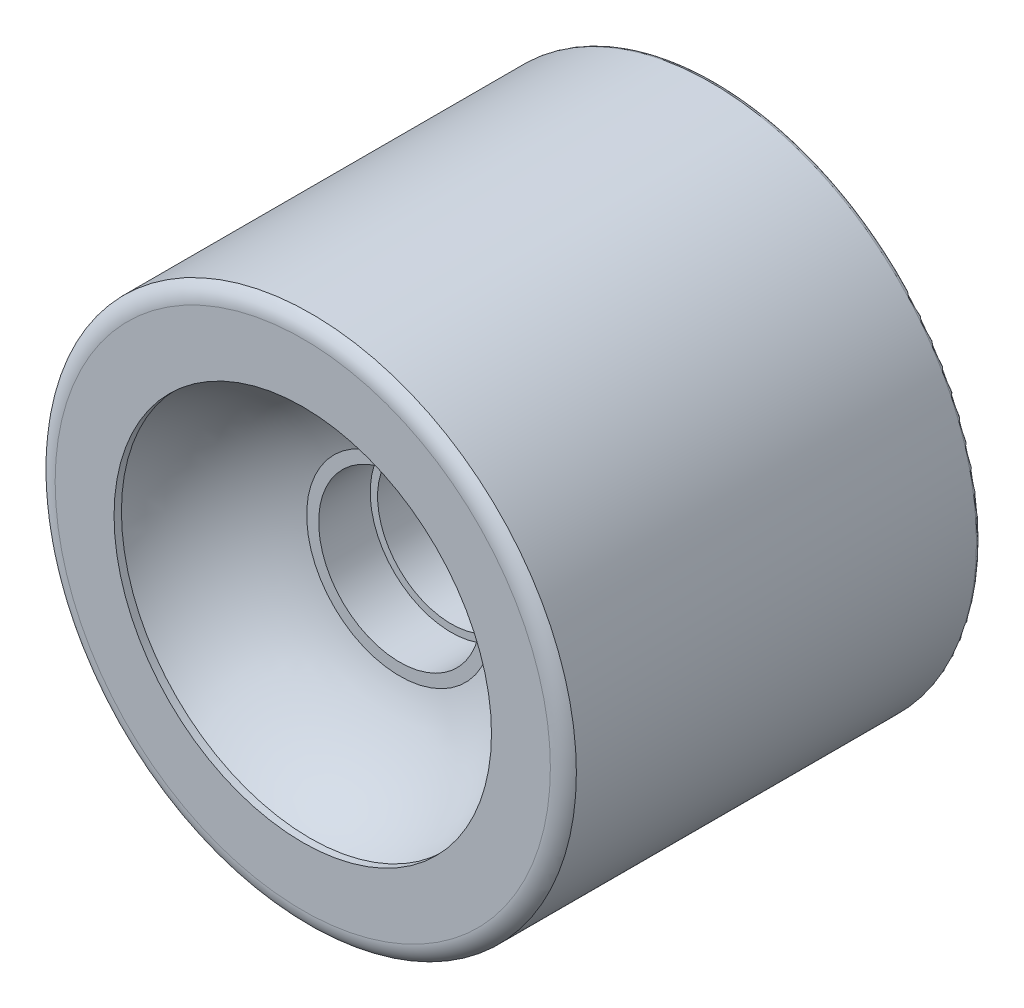
ISO-10303-21;
HEADER;
FILE_DESCRIPTION(('STEP AP214'),'2;1');
FILE_NAME('part.step','',(''),(''),'','','');
FILE_SCHEMA(('AUTOMOTIVE_DESIGN { 1 0 10303 214 1 1 1 1 }'));
ENDSEC;
DATA;
#1=APPLICATION_CONTEXT('core data for automotive mechanical design processes');
#2=APPLICATION_PROTOCOL_DEFINITION('international standard','automotive_design',2000,#1);
#3=PRODUCT_CONTEXT('',#1,'mechanical');
#4=PRODUCT('Part','Part','',(#3));
#5=PRODUCT_RELATED_PRODUCT_CATEGORY('part','',(#4));
#6=PRODUCT_DEFINITION_FORMATION('','',#4);
#7=PRODUCT_DEFINITION_CONTEXT('part definition',#1,'design');
#8=PRODUCT_DEFINITION('design','',#6,#7);
#9=PRODUCT_DEFINITION_SHAPE('','',#8);
#10=(LENGTH_UNIT() NAMED_UNIT(*) SI_UNIT(.MILLI.,.METRE.));
#11=(NAMED_UNIT(*) PLANE_ANGLE_UNIT() SI_UNIT($,.RADIAN.));
#12=(NAMED_UNIT(*) SI_UNIT($,.STERADIAN.) SOLID_ANGLE_UNIT());
#13=UNCERTAINTY_MEASURE_WITH_UNIT(LENGTH_MEASURE(1.E-05),#10,'distance_accuracy_value','');
#14=(GEOMETRIC_REPRESENTATION_CONTEXT(3) GLOBAL_UNCERTAINTY_ASSIGNED_CONTEXT((#13)) GLOBAL_UNIT_ASSIGNED_CONTEXT((#10,
#11,#12)) REPRESENTATION_CONTEXT('',''));
#15=CARTESIAN_POINT('',(0.,0.,0.));
#16=DIRECTION('',(0.,0.,1.));
#17=DIRECTION('',(1.,0.,0.));
#18=AXIS2_PLACEMENT_3D('',#15,#16,#17);
#19=CARTESIAN_POINT('',(30.,0.,-56.));
#20=DIRECTION('',(0.,0.,-1.));
#21=DIRECTION('',(-1.,0.,0.));
#22=AXIS2_PLACEMENT_3D('',#19,#20,#21);
#23=PLANE('',#22);
#24=CARTESIAN_POINT('',(0.,0.,-56.));
#25=DIRECTION('',(0.,0.,-1.));
#26=DIRECTION('',(-1.,0.,0.));
#27=AXIS2_PLACEMENT_3D('',#24,#25,#26);
#28=CIRCLE('',#27,35.5);
#29=CARTESIAN_POINT('',(-35.5,0.,-56.));
#30=VERTEX_POINT('',#29);
#31=EDGE_CURVE('E10',#30,#30,#28,.T.);
#32=ORIENTED_EDGE('',*,*,#31,.T.);
#33=EDGE_LOOP('',(#32));
#34=FACE_BOUND('',#33,.T.);
#35=CARTESIAN_POINT('',(0.,0.,-56.));
#36=DIRECTION('',(0.,0.,1.));
#37=DIRECTION('',(1.,0.,0.));
#38=AXIS2_PLACEMENT_3D('',#35,#36,#37);
#39=CIRCLE('',#38,30.);
#40=CARTESIAN_POINT('',(30.,0.,-56.));
#41=VERTEX_POINT('',#40);
#42=EDGE_CURVE('E86',#41,#41,#39,.T.);
#43=ORIENTED_EDGE('',*,*,#42,.T.);
#44=EDGE_LOOP('',(#43));
#45=FACE_BOUND('',#44,.T.);
#46=ADVANCED_FACE('F30',(#34,#45),#23,.T.);
#47=CARTESIAN_POINT('',(0.,0.,0.));
#48=DIRECTION('',(0.,0.,1.));
#49=DIRECTION('',(1.,0.,0.));
#50=AXIS2_PLACEMENT_3D('',#47,#48,#49);
#51=CYLINDRICAL_SURFACE('',#50,36.);
#52=CARTESIAN_POINT('',(0.,0.,-55.5));
#53=DIRECTION('',(0.,0.,-1.));
#54=DIRECTION('',(-1.,0.,0.));
#55=AXIS2_PLACEMENT_3D('',#52,#53,#54);
#56=CIRCLE('',#55,36.);
#57=CARTESIAN_POINT('',(-36.,0.,-55.5));
#58=VERTEX_POINT('',#57);
#59=EDGE_CURVE('E37',#58,#58,#56,.F.);
#60=ORIENTED_EDGE('',*,*,#59,.T.);
#61=EDGE_LOOP('',(#60));
#62=FACE_BOUND('',#61,.T.);
#63=CARTESIAN_POINT('',(0.,0.,-1.16067947328369));
#64=DIRECTION('',(0.,0.,1.));
#65=DIRECTION('',(1.,0.,0.));
#66=AXIS2_PLACEMENT_3D('',#63,#64,#65);
#67=CIRCLE('',#66,36.);
#68=CARTESIAN_POINT('',(36.,0.,-1.16067947328369));
#69=VERTEX_POINT('',#68);
#70=EDGE_CURVE('E41',#69,#69,#67,.T.);
#71=ORIENTED_EDGE('',*,*,#70,.F.);
#72=EDGE_LOOP('',(#71));
#73=FACE_BOUND('',#72,.T.);
#74=ADVANCED_FACE('F105',(#62,#73),#51,.T.);
#75=CARTESIAN_POINT('',(0.,0.,-3.));
#76=DIRECTION('',(0.,0.,1.));
#77=DIRECTION('',(1.,0.,0.));
#78=AXIS2_PLACEMENT_3D('',#75,#76,#77);
#79=TOROIDAL_SURFACE('',#78,33.63,3.);
#80=ORIENTED_EDGE('',*,*,#70,.T.);
#81=EDGE_LOOP('',(#80));
#82=FACE_BOUND('',#81,.T.);
#83=CARTESIAN_POINT('',(0.,0.,0.));
#84=DIRECTION('',(0.,0.,1.));
#85=DIRECTION('',(1.,0.,0.));
#86=AXIS2_PLACEMENT_3D('',#83,#84,#85);
#87=CIRCLE('',#86,33.63);
#88=CARTESIAN_POINT('',(33.63,0.,0.));
#89=VERTEX_POINT('',#88);
#90=EDGE_CURVE('E45',#89,#89,#87,.T.);
#91=ORIENTED_EDGE('',*,*,#90,.F.);
#92=EDGE_LOOP('',(#91));
#93=FACE_BOUND('',#92,.T.);
#94=ADVANCED_FACE('F109',(#82,#93),#79,.T.);
#95=CARTESIAN_POINT('',(33.63,0.,0.));
#96=DIRECTION('',(0.,0.,1.));
#97=DIRECTION('',(1.,0.,0.));
#98=AXIS2_PLACEMENT_3D('',#95,#96,#97);
#99=PLANE('',#98);
#100=ORIENTED_EDGE('',*,*,#90,.T.);
#101=EDGE_LOOP('',(#100));
#102=FACE_BOUND('',#101,.T.);
#103=CARTESIAN_POINT('',(0.,0.,0.));
#104=DIRECTION('',(0.,0.,1.));
#105=DIRECTION('',(1.,0.,0.));
#106=AXIS2_PLACEMENT_3D('',#103,#104,#105);
#107=CIRCLE('',#106,25.63);
#108=CARTESIAN_POINT('',(25.63,0.,0.));
#109=VERTEX_POINT('',#108);
#110=EDGE_CURVE('E50',#109,#109,#107,.T.);
#111=ORIENTED_EDGE('',*,*,#110,.F.);
#112=EDGE_LOOP('',(#111));
#113=FACE_BOUND('',#112,.T.);
#114=ADVANCED_FACE('F114',(#102,#113),#99,.T.);
#115=CARTESIAN_POINT('',(0.,0.,0.));
#116=DIRECTION('',(0.,0.,1.));
#117=DIRECTION('',(1.,0.,0.));
#118=AXIS2_PLACEMENT_3D('',#115,#116,#117);
#119=CYLINDRICAL_SURFACE('',#118,25.63);
#120=ORIENTED_EDGE('',*,*,#110,.T.);
#121=EDGE_LOOP('',(#120));
#122=FACE_BOUND('',#121,.T.);
#123=CARTESIAN_POINT('',(0.,0.,-1.));
#124=DIRECTION('',(0.,0.,1.));
#125=DIRECTION('',(1.,0.,0.));
#126=AXIS2_PLACEMENT_3D('',#123,#124,#125);
#127=CIRCLE('',#126,25.63);
#128=CARTESIAN_POINT('',(25.63,0.,-1.));
#129=VERTEX_POINT('',#128);
#130=EDGE_CURVE('E53',#129,#129,#127,.T.);
#131=ORIENTED_EDGE('',*,*,#130,.F.);
#132=EDGE_LOOP('',(#131));
#133=FACE_BOUND('',#132,.T.);
#134=ADVANCED_FACE('F118',(#122,#133),#119,.F.);
#135=CARTESIAN_POINT('',(0.,0.,6.0001246931818));
#136=DIRECTION('',(0.,0.,1.));
#137=DIRECTION('',(1.,0.,0.));
#138=AXIS2_PLACEMENT_3D('',#135,#136,#137);
#139=DEGENERATE_TOROIDAL_SURFACE('',#138,6.89505259468534,20.,.T.);
#140=ORIENTED_EDGE('',*,*,#130,.T.);
#141=EDGE_LOOP('',(#140));
#142=FACE_BOUND('',#141,.T.);
#143=CARTESIAN_POINT('',(0.,0.,-13.16));
#144=DIRECTION('',(0.,0.,1.));
#145=DIRECTION('',(1.,0.,0.));
#146=AXIS2_PLACEMENT_3D('',#143,#144,#145);
#147=CIRCLE('',#146,12.63);
#148=CARTESIAN_POINT('',(12.63,0.,-13.16));
#149=VERTEX_POINT('',#148);
#150=EDGE_CURVE('E56',#149,#149,#147,.T.);
#151=ORIENTED_EDGE('',*,*,#150,.F.);
#152=EDGE_LOOP('',(#151));
#153=FACE_BOUND('',#152,.T.);
#154=ADVANCED_FACE('F122',(#142,#153),#139,.F.);
#155=CARTESIAN_POINT('',(11.,0.,-13.16));
#156=DIRECTION('',(0.,0.,1.));
#157=DIRECTION('',(1.,0.,0.));
#158=AXIS2_PLACEMENT_3D('',#155,#156,#157);
#159=PLANE('',#158);
#160=ORIENTED_EDGE('',*,*,#150,.T.);
#161=EDGE_LOOP('',(#160));
#162=FACE_BOUND('',#161,.T.);
#163=CARTESIAN_POINT('',(0.,0.,-13.16));
#164=DIRECTION('',(0.,0.,1.));
#165=DIRECTION('',(1.,0.,0.));
#166=AXIS2_PLACEMENT_3D('',#163,#164,#165);
#167=CIRCLE('',#166,11.);
#168=CARTESIAN_POINT('',(11.,0.,-13.16));
#169=VERTEX_POINT('',#168);
#170=EDGE_CURVE('E59',#169,#169,#167,.T.);
#171=ORIENTED_EDGE('',*,*,#170,.F.);
#172=EDGE_LOOP('',(#171));
#173=FACE_BOUND('',#172,.T.);
#174=ADVANCED_FACE('F126',(#162,#173),#159,.T.);
#175=CARTESIAN_POINT('',(0.,0.,0.));
#176=DIRECTION('',(0.,0.,1.));
#177=DIRECTION('',(1.,0.,0.));
#178=AXIS2_PLACEMENT_3D('',#175,#176,#177);
#179=CYLINDRICAL_SURFACE('',#178,11.);
#180=ORIENTED_EDGE('',*,*,#170,.T.);
#181=EDGE_LOOP('',(#180));
#182=FACE_BOUND('',#181,.T.);
#183=CARTESIAN_POINT('',(0.,0.,-20.16));
#184=DIRECTION('',(0.,0.,1.));
#185=DIRECTION('',(1.,0.,0.));
#186=AXIS2_PLACEMENT_3D('',#183,#184,#185);
#187=CIRCLE('',#186,11.);
#188=CARTESIAN_POINT('',(11.,0.,-20.16));
#189=VERTEX_POINT('',#188);
#190=EDGE_CURVE('E62',#189,#189,#187,.T.);
#191=ORIENTED_EDGE('',*,*,#190,.F.);
#192=EDGE_LOOP('',(#191));
#193=FACE_BOUND('',#192,.T.);
#194=ADVANCED_FACE('F130',(#182,#193),#179,.F.);
#195=CARTESIAN_POINT('',(11.,0.,-20.16));
#196=DIRECTION('',(0.,0.,1.));
#197=DIRECTION('',(1.,0.,0.));
#198=AXIS2_PLACEMENT_3D('',#195,#196,#197);
#199=PLANE('',#198);
#200=ORIENTED_EDGE('',*,*,#190,.T.);
#201=EDGE_LOOP('',(#200));
#202=FACE_BOUND('',#201,.T.);
#203=CARTESIAN_POINT('',(0.,0.,-20.16));
#204=DIRECTION('',(0.,0.,1.));
#205=DIRECTION('',(1.,0.,0.));
#206=AXIS2_PLACEMENT_3D('',#203,#204,#205);
#207=CIRCLE('',#206,9.99999999999999);
#208=CARTESIAN_POINT('',(9.99999999999999,0.,-20.16));
#209=VERTEX_POINT('',#208);
#210=EDGE_CURVE('E65',#209,#209,#207,.T.);
#211=ORIENTED_EDGE('',*,*,#210,.F.);
#212=EDGE_LOOP('',(#211));
#213=FACE_BOUND('',#212,.T.);
#214=ADVANCED_FACE('F134',(#202,#213),#199,.T.);
#215=CARTESIAN_POINT('',(0.,0.,0.));
#216=DIRECTION('',(0.,0.,1.));
#217=DIRECTION('',(1.,0.,0.));
#218=AXIS2_PLACEMENT_3D('',#215,#216,#217);
#219=CYLINDRICAL_SURFACE('',#218,9.99999999999999);
#220=ORIENTED_EDGE('',*,*,#210,.T.);
#221=EDGE_LOOP('',(#220));
#222=FACE_BOUND('',#221,.T.);
#223=CARTESIAN_POINT('',(0.,0.,-30.16));
#224=DIRECTION('',(0.,0.,1.));
#225=DIRECTION('',(1.,0.,0.));
#226=AXIS2_PLACEMENT_3D('',#223,#224,#225);
#227=CIRCLE('',#226,9.99999999999999);
#228=CARTESIAN_POINT('',(9.99999999999999,0.,-30.16));
#229=VERTEX_POINT('',#228);
#230=EDGE_CURVE('E68',#229,#229,#227,.T.);
#231=ORIENTED_EDGE('',*,*,#230,.F.);
#232=EDGE_LOOP('',(#231));
#233=FACE_BOUND('',#232,.T.);
#234=ADVANCED_FACE('F138',(#222,#233),#219,.F.);
#235=CARTESIAN_POINT('',(9.99999999999999,0.,-30.16));
#236=DIRECTION('',(0.,0.,-1.));
#237=DIRECTION('',(-1.,0.,0.));
#238=AXIS2_PLACEMENT_3D('',#235,#236,#237);
#239=PLANE('',#238);
#240=ORIENTED_EDGE('',*,*,#230,.T.);
#241=EDGE_LOOP('',(#240));
#242=FACE_BOUND('',#241,.T.);
#243=CARTESIAN_POINT('',(0.,0.,-30.16));
#244=DIRECTION('',(0.,0.,1.));
#245=DIRECTION('',(1.,0.,0.));
#246=AXIS2_PLACEMENT_3D('',#243,#244,#245);
#247=CIRCLE('',#246,11.);
#248=CARTESIAN_POINT('',(11.,0.,-30.16));
#249=VERTEX_POINT('',#248);
#250=EDGE_CURVE('E71',#249,#249,#247,.T.);
#251=ORIENTED_EDGE('',*,*,#250,.F.);
#252=EDGE_LOOP('',(#251));
#253=FACE_BOUND('',#252,.T.);
#254=ADVANCED_FACE('F142',(#242,#253),#239,.T.);
#255=CARTESIAN_POINT('',(0.,0.,0.));
#256=DIRECTION('',(0.,0.,1.));
#257=DIRECTION('',(1.,0.,0.));
#258=AXIS2_PLACEMENT_3D('',#255,#256,#257);
#259=CYLINDRICAL_SURFACE('',#258,11.);
#260=ORIENTED_EDGE('',*,*,#250,.T.);
#261=EDGE_LOOP('',(#260));
#262=FACE_BOUND('',#261,.T.);
#263=CARTESIAN_POINT('',(0.,0.,-37.16));
#264=DIRECTION('',(0.,0.,1.));
#265=DIRECTION('',(1.,0.,0.));
#266=AXIS2_PLACEMENT_3D('',#263,#264,#265);
#267=CIRCLE('',#266,11.);
#268=CARTESIAN_POINT('',(11.,0.,-37.16));
#269=VERTEX_POINT('',#268);
#270=EDGE_CURVE('E74',#269,#269,#267,.T.);
#271=ORIENTED_EDGE('',*,*,#270,.F.);
#272=EDGE_LOOP('',(#271));
#273=FACE_BOUND('',#272,.T.);
#274=ADVANCED_FACE('F146',(#262,#273),#259,.F.);
#275=CARTESIAN_POINT('',(11.,0.,-37.16));
#276=DIRECTION('',(0.,0.,-1.));
#277=DIRECTION('',(-1.,0.,0.));
#278=AXIS2_PLACEMENT_3D('',#275,#276,#277);
#279=PLANE('',#278);
#280=ORIENTED_EDGE('',*,*,#270,.T.);
#281=EDGE_LOOP('',(#280));
#282=FACE_BOUND('',#281,.T.);
#283=CARTESIAN_POINT('',(0.,0.,-37.16));
#284=DIRECTION('',(0.,0.,1.));
#285=DIRECTION('',(1.,0.,0.));
#286=AXIS2_PLACEMENT_3D('',#283,#284,#285);
#287=CIRCLE('',#286,12.63);
#288=CARTESIAN_POINT('',(12.63,0.,-37.16));
#289=VERTEX_POINT('',#288);
#290=EDGE_CURVE('E77',#289,#289,#287,.T.);
#291=ORIENTED_EDGE('',*,*,#290,.F.);
#292=EDGE_LOOP('',(#291));
#293=FACE_BOUND('',#292,.T.);
#294=ADVANCED_FACE('F150',(#282,#293),#279,.T.);
#295=CARTESIAN_POINT('',(0.,0.,-37.16));
#296=DIRECTION('',(0.,0.,1.));
#297=DIRECTION('',(1.,0.,0.));
#298=AXIS2_PLACEMENT_3D('',#295,#296,#297);
#299=TOROIDAL_SURFACE('',#298,16.63,4.);
#300=ORIENTED_EDGE('',*,*,#290,.T.);
#301=EDGE_LOOP('',(#300));
#302=FACE_BOUND('',#301,.T.);
#303=CARTESIAN_POINT('',(0.,0.,-40.0942241065245));
#304=DIRECTION('',(0.,0.,1.));
#305=DIRECTION('',(1.,0.,0.));
#306=AXIS2_PLACEMENT_3D('',#303,#304,#305);
#307=CIRCLE('',#306,13.9114840642934);
#308=CARTESIAN_POINT('',(13.9114840642934,0.,-40.0942241065245));
#309=VERTEX_POINT('',#308);
#310=EDGE_CURVE('E80',#309,#309,#307,.T.);
#311=ORIENTED_EDGE('',*,*,#310,.F.);
#312=EDGE_LOOP('',(#311));
#313=FACE_BOUND('',#312,.T.);
#314=ADVANCED_FACE('F101',(#302,#313),#299,.T.);
#315=CARTESIAN_POINT('',(0.,0.,-55.));
#316=DIRECTION('',(0.,0.,-1.));
#317=DIRECTION('',(-1.,0.,0.));
#318=AXIS2_PLACEMENT_3D('',#315,#316,#317);
#319=CONICAL_SURFACE('',#318,30.,0.823539588132955);
#320=ORIENTED_EDGE('',*,*,#310,.T.);
#321=EDGE_LOOP('',(#320));
#322=FACE_BOUND('',#321,.T.);
#323=CARTESIAN_POINT('',(0.,0.,-55.));
#324=DIRECTION('',(0.,0.,1.));
#325=DIRECTION('',(1.,0.,0.));
#326=AXIS2_PLACEMENT_3D('',#323,#324,#325);
#327=CIRCLE('',#326,30.);
#328=CARTESIAN_POINT('',(30.,0.,-55.));
#329=VERTEX_POINT('',#328);
#330=EDGE_CURVE('E83',#329,#329,#327,.T.);
#331=ORIENTED_EDGE('',*,*,#330,.F.);
#332=EDGE_LOOP('',(#331));
#333=FACE_BOUND('',#332,.T.);
#334=ADVANCED_FACE('F93',(#322,#333),#319,.F.);
#335=CARTESIAN_POINT('',(0.,0.,0.));
#336=DIRECTION('',(0.,0.,1.));
#337=DIRECTION('',(1.,0.,0.));
#338=AXIS2_PLACEMENT_3D('',#335,#336,#337);
#339=CYLINDRICAL_SURFACE('',#338,30.);
#340=ORIENTED_EDGE('',*,*,#330,.T.);
#341=EDGE_LOOP('',(#340));
#342=FACE_BOUND('',#341,.T.);
#343=ORIENTED_EDGE('',*,*,#42,.F.);
#344=EDGE_LOOP('',(#343));
#345=FACE_BOUND('',#344,.T.);
#346=ADVANCED_FACE('F91',(#342,#345),#339,.F.);
#347=CARTESIAN_POINT('',(0.,0.,-55.5));
#348=DIRECTION('',(0.,0.,-1.));
#349=DIRECTION('',(-1.,0.,0.));
#350=AXIS2_PLACEMENT_3D('',#347,#348,#349);
#351=TOROIDAL_SURFACE('',#350,35.5,0.5);
#352=ORIENTED_EDGE('',*,*,#31,.F.);
#353=EDGE_LOOP('',(#352));
#354=FACE_BOUND('',#353,.T.);
#355=ORIENTED_EDGE('',*,*,#59,.F.);
#356=EDGE_LOOP('',(#355));
#357=FACE_BOUND('',#356,.T.);
#358=ADVANCED_FACE('F32',(#354,#357),#351,.T.);
#359=CLOSED_SHELL('',(#46,#74,#94,#114,#134,#154,#174,#194,#214,#234,#254,#274,#294,#314,#334,
#346,#358));
#360=MANIFOLD_SOLID_BREP('B2',#359);
#361=ADVANCED_BREP_SHAPE_REPRESENTATION('',(#18,#360),#14);
#362=SHAPE_DEFINITION_REPRESENTATION(#9,#361);
ENDSEC;
END-ISO-10303-21;
